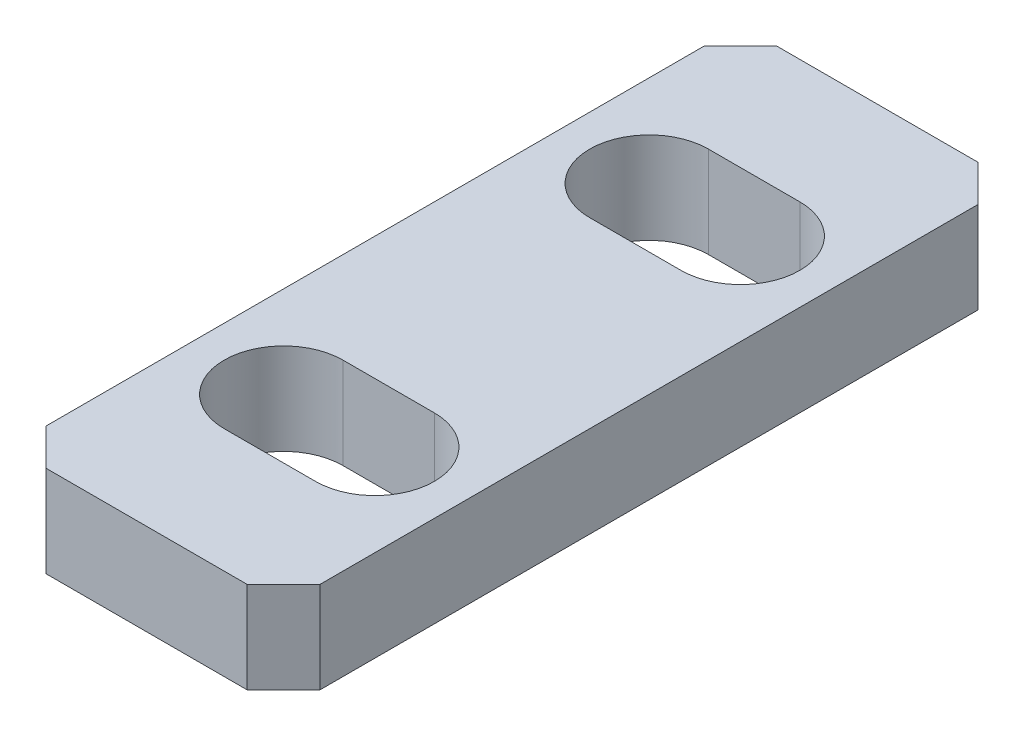
ISO-10303-21;
HEADER;
FILE_DESCRIPTION(('STEP AP214'),'2;1');
FILE_NAME('part.step','',(''),(''),'','','');
FILE_SCHEMA(('AUTOMOTIVE_DESIGN { 1 0 10303 214 1 1 1 1 }'));
ENDSEC;
DATA;
#1=APPLICATION_CONTEXT('core data for automotive mechanical design processes');
#2=APPLICATION_PROTOCOL_DEFINITION('international standard','automotive_design',2000,#1);
#3=PRODUCT_CONTEXT('',#1,'mechanical');
#4=PRODUCT('Part','Part','',(#3));
#5=PRODUCT_RELATED_PRODUCT_CATEGORY('part','',(#4));
#6=PRODUCT_DEFINITION_FORMATION('','',#4);
#7=PRODUCT_DEFINITION_CONTEXT('part definition',#1,'design');
#8=PRODUCT_DEFINITION('design','',#6,#7);
#9=PRODUCT_DEFINITION_SHAPE('','',#8);
#10=(LENGTH_UNIT() NAMED_UNIT(*) SI_UNIT(.MILLI.,.METRE.));
#11=(NAMED_UNIT(*) PLANE_ANGLE_UNIT() SI_UNIT($,.RADIAN.));
#12=(NAMED_UNIT(*) SI_UNIT($,.STERADIAN.) SOLID_ANGLE_UNIT());
#13=UNCERTAINTY_MEASURE_WITH_UNIT(LENGTH_MEASURE(1.E-05),#10,'distance_accuracy_value','');
#14=(GEOMETRIC_REPRESENTATION_CONTEXT(3) GLOBAL_UNCERTAINTY_ASSIGNED_CONTEXT((#13)) GLOBAL_UNIT_ASSIGNED_CONTEXT((#10,
#11,#12)) REPRESENTATION_CONTEXT('',''));
#15=CARTESIAN_POINT('',(0.,0.,0.));
#16=DIRECTION('',(0.,0.,1.));
#17=DIRECTION('',(1.,0.,0.));
#18=AXIS2_PLACEMENT_3D('',#15,#16,#17);
#19=CARTESIAN_POINT('',(0.,5.,0.));
#20=DIRECTION('',(0.,-1.,0.));
#21=DIRECTION('',(0.,0.,-1.));
#22=AXIS2_PLACEMENT_3D('',#19,#20,#21);
#23=PLANE('',#22);
#24=CARTESIAN_POINT('',(5.,5.,-30.));
#25=DIRECTION('',(0.,1.,0.));
#26=DIRECTION('',(0.,0.,1.));
#27=AXIS2_PLACEMENT_3D('',#24,#25,#26);
#28=CIRCLE('',#27,3.25);
#29=CARTESIAN_POINT('',(5.,5.,-33.25));
#30=VERTEX_POINT('',#29);
#31=CARTESIAN_POINT('',(5.,5.,-26.75));
#32=VERTEX_POINT('',#31);
#33=EDGE_CURVE('E201',#30,#32,#28,.T.);
#34=ORIENTED_EDGE('',*,*,#33,.F.);
#35=DIRECTION('',(-1.,0.,0.));
#36=VECTOR('',#35,1.);
#37=CARTESIAN_POINT('',(5.,5.,-33.25));
#38=LINE('',#37,#36);
#39=CARTESIAN_POINT('',(9.99999999999999,5.,-33.25));
#40=VERTEX_POINT('',#39);
#41=EDGE_CURVE('E212',#40,#30,#38,.T.);
#42=ORIENTED_EDGE('',*,*,#41,.F.);
#43=CARTESIAN_POINT('',(10.,5.,-30.));
#44=DIRECTION('',(0.,1.,0.));
#45=DIRECTION('',(0.,0.,1.));
#46=AXIS2_PLACEMENT_3D('',#43,#44,#45);
#47=CIRCLE('',#46,3.25);
#48=CARTESIAN_POINT('',(10.,5.,-26.75));
#49=VERTEX_POINT('',#48);
#50=EDGE_CURVE('E208',#49,#40,#47,.T.);
#51=ORIENTED_EDGE('',*,*,#50,.F.);
#52=DIRECTION('',(1.,0.,0.));
#53=VECTOR('',#52,1.);
#54=CARTESIAN_POINT('',(5.,5.,-26.75));
#55=LINE('',#54,#53);
#56=EDGE_CURVE('E204',#32,#49,#55,.T.);
#57=ORIENTED_EDGE('',*,*,#56,.F.);
#58=EDGE_LOOP('',(#34,#42,#51,#57));
#59=FACE_BOUND('',#58,.T.);
#60=DIRECTION('',(0.,0.,1.));
#61=VECTOR('',#60,1.);
#62=CARTESIAN_POINT('',(0.,5.,-1.99999999999999));
#63=LINE('',#62,#61);
#64=CARTESIAN_POINT('',(0.,5.,-38.));
#65=VERTEX_POINT('',#64);
#66=CARTESIAN_POINT('',(0.,5.,-1.99999999999999));
#67=VERTEX_POINT('',#66);
#68=EDGE_CURVE('E244',#65,#67,#63,.T.);
#69=ORIENTED_EDGE('',*,*,#68,.T.);
#70=DIRECTION('',(0.707106781186549,0.,0.707106781186546));
#71=VECTOR('',#70,1.);
#72=CARTESIAN_POINT('',(0.,5.,-1.99999999999999));
#73=LINE('',#72,#71);
#74=CARTESIAN_POINT('',(2.,5.,0.));
#75=VERTEX_POINT('',#74);
#76=EDGE_CURVE('E248',#67,#75,#73,.T.);
#77=ORIENTED_EDGE('',*,*,#76,.T.);
#78=DIRECTION('',(1.,0.,0.));
#79=VECTOR('',#78,1.);
#80=CARTESIAN_POINT('',(2.,5.,0.));
#81=LINE('',#80,#79);
#82=CARTESIAN_POINT('',(13.,5.,0.));
#83=VERTEX_POINT('',#82);
#84=EDGE_CURVE('E252',#75,#83,#81,.T.);
#85=ORIENTED_EDGE('',*,*,#84,.T.);
#86=DIRECTION('',(0.707106781186549,0.,-0.707106781186546));
#87=VECTOR('',#86,1.);
#88=CARTESIAN_POINT('',(13.,5.,0.));
#89=LINE('',#88,#87);
#90=CARTESIAN_POINT('',(15.,5.,-1.99999999999999));
#91=VERTEX_POINT('',#90);
#92=EDGE_CURVE('E255',#83,#91,#89,.T.);
#93=ORIENTED_EDGE('',*,*,#92,.T.);
#94=DIRECTION('',(0.,0.,-1.));
#95=VECTOR('',#94,1.);
#96=CARTESIAN_POINT('',(15.,5.,-1.99999999999999));
#97=LINE('',#96,#95);
#98=CARTESIAN_POINT('',(15.,5.,-38.));
#99=VERTEX_POINT('',#98);
#100=EDGE_CURVE('E258',#91,#99,#97,.T.);
#101=ORIENTED_EDGE('',*,*,#100,.T.);
#102=DIRECTION('',(-0.707106781186548,0.,-0.707106781186547));
#103=VECTOR('',#102,1.);
#104=CARTESIAN_POINT('',(13.,5.,-40.));
#105=LINE('',#104,#103);
#106=CARTESIAN_POINT('',(13.,5.,-40.));
#107=VERTEX_POINT('',#106);
#108=EDGE_CURVE('E261',#99,#107,#105,.T.);
#109=ORIENTED_EDGE('',*,*,#108,.T.);
#110=DIRECTION('',(-1.,0.,0.));
#111=VECTOR('',#110,1.);
#112=CARTESIAN_POINT('',(1.99999999999999,5.,-40.));
#113=LINE('',#112,#111);
#114=CARTESIAN_POINT('',(1.99999999999999,5.,-40.));
#115=VERTEX_POINT('',#114);
#116=EDGE_CURVE('E264',#107,#115,#113,.T.);
#117=ORIENTED_EDGE('',*,*,#116,.T.);
#118=DIRECTION('',(-0.707106781186546,0.,0.707106781186549));
#119=VECTOR('',#118,1.);
#120=CARTESIAN_POINT('',(0.,5.,-38.));
#121=LINE('',#120,#119);
#122=EDGE_CURVE('E267',#115,#65,#121,.T.);
#123=ORIENTED_EDGE('',*,*,#122,.T.);
#124=EDGE_LOOP('',(#69,#77,#85,#93,#101,#109,#117,#123));
#125=FACE_BOUND('',#124,.T.);
#126=CARTESIAN_POINT('',(5.,5.,-10.));
#127=DIRECTION('',(0.,1.,0.));
#128=DIRECTION('',(0.,0.,1.));
#129=AXIS2_PLACEMENT_3D('',#126,#127,#128);
#130=CIRCLE('',#129,3.25);
#131=CARTESIAN_POINT('',(5.,5.,-13.25));
#132=VERTEX_POINT('',#131);
#133=CARTESIAN_POINT('',(5.,5.,-6.75));
#134=VERTEX_POINT('',#133);
#135=EDGE_CURVE('E153',#132,#134,#130,.T.);
#136=ORIENTED_EDGE('',*,*,#135,.F.);
#137=DIRECTION('',(-1.,0.,0.));
#138=VECTOR('',#137,1.);
#139=CARTESIAN_POINT('',(5.,5.,-13.25));
#140=LINE('',#139,#138);
#141=CARTESIAN_POINT('',(10.,5.,-13.25));
#142=VERTEX_POINT('',#141);
#143=EDGE_CURVE('E179',#142,#132,#140,.T.);
#144=ORIENTED_EDGE('',*,*,#143,.F.);
#145=CARTESIAN_POINT('',(10.,5.,-10.));
#146=DIRECTION('',(0.,1.,0.));
#147=DIRECTION('',(0.,0.,1.));
#148=AXIS2_PLACEMENT_3D('',#145,#146,#147);
#149=CIRCLE('',#148,3.25);
#150=CARTESIAN_POINT('',(10.,5.,-6.75));
#151=VERTEX_POINT('',#150);
#152=EDGE_CURVE('E175',#151,#142,#149,.T.);
#153=ORIENTED_EDGE('',*,*,#152,.F.);
#154=DIRECTION('',(1.,0.,0.));
#155=VECTOR('',#154,1.);
#156=CARTESIAN_POINT('',(5.,5.,-6.75));
#157=LINE('',#156,#155);
#158=EDGE_CURVE('E162',#134,#151,#157,.T.);
#159=ORIENTED_EDGE('',*,*,#158,.F.);
#160=EDGE_LOOP('',(#136,#144,#153,#159));
#161=FACE_BOUND('',#160,.T.);
#162=ADVANCED_FACE('F39',(#59,#125,#161),#23,.F.);
#163=CARTESIAN_POINT('',(0.,0.,0.));
#164=DIRECTION('',(0.,-1.,0.));
#165=DIRECTION('',(0.,0.,-1.));
#166=AXIS2_PLACEMENT_3D('',#163,#164,#165);
#167=PLANE('',#166);
#168=DIRECTION('',(0.,0.,1.));
#169=VECTOR('',#168,1.);
#170=CARTESIAN_POINT('',(0.,0.,-1.99999999999999));
#171=LINE('',#170,#169);
#172=CARTESIAN_POINT('',(0.,0.,-38.));
#173=VERTEX_POINT('',#172);
#174=CARTESIAN_POINT('',(0.,0.,-1.99999999999999));
#175=VERTEX_POINT('',#174);
#176=EDGE_CURVE('E243',#173,#175,#171,.T.);
#177=ORIENTED_EDGE('',*,*,#176,.F.);
#178=DIRECTION('',(-0.707106781186546,0.,0.707106781186549));
#179=VECTOR('',#178,1.);
#180=CARTESIAN_POINT('',(0.,0.,-38.));
#181=LINE('',#180,#179);
#182=CARTESIAN_POINT('',(1.99999999999999,0.,-40.));
#183=VERTEX_POINT('',#182);
#184=EDGE_CURVE('E249',#183,#173,#181,.T.);
#185=ORIENTED_EDGE('',*,*,#184,.F.);
#186=DIRECTION('',(-1.,0.,0.));
#187=VECTOR('',#186,1.);
#188=CARTESIAN_POINT('',(1.99999999999999,0.,-40.));
#189=LINE('',#188,#187);
#190=CARTESIAN_POINT('',(13.,0.,-40.));
#191=VERTEX_POINT('',#190);
#192=EDGE_CURVE('E289',#191,#183,#189,.T.);
#193=ORIENTED_EDGE('',*,*,#192,.F.);
#194=DIRECTION('',(-0.707106781186548,0.,-0.707106781186547));
#195=VECTOR('',#194,1.);
#196=CARTESIAN_POINT('',(13.,0.,-40.));
#197=LINE('',#196,#195);
#198=CARTESIAN_POINT('',(15.,0.,-38.));
#199=VERTEX_POINT('',#198);
#200=EDGE_CURVE('E286',#199,#191,#197,.T.);
#201=ORIENTED_EDGE('',*,*,#200,.F.);
#202=DIRECTION('',(0.,0.,-1.));
#203=VECTOR('',#202,1.);
#204=CARTESIAN_POINT('',(15.,0.,-1.99999999999999));
#205=LINE('',#204,#203);
#206=CARTESIAN_POINT('',(15.,0.,-1.99999999999999));
#207=VERTEX_POINT('',#206);
#208=EDGE_CURVE('E283',#207,#199,#205,.T.);
#209=ORIENTED_EDGE('',*,*,#208,.F.);
#210=DIRECTION('',(0.707106781186549,0.,-0.707106781186546));
#211=VECTOR('',#210,1.);
#212=CARTESIAN_POINT('',(13.,0.,0.));
#213=LINE('',#212,#211);
#214=CARTESIAN_POINT('',(13.,0.,0.));
#215=VERTEX_POINT('',#214);
#216=EDGE_CURVE('E280',#215,#207,#213,.T.);
#217=ORIENTED_EDGE('',*,*,#216,.F.);
#218=DIRECTION('',(1.,0.,0.));
#219=VECTOR('',#218,1.);
#220=CARTESIAN_POINT('',(2.,0.,0.));
#221=LINE('',#220,#219);
#222=CARTESIAN_POINT('',(2.,0.,0.));
#223=VERTEX_POINT('',#222);
#224=EDGE_CURVE('E277',#223,#215,#221,.T.);
#225=ORIENTED_EDGE('',*,*,#224,.F.);
#226=DIRECTION('',(0.707106781186549,0.,0.707106781186546));
#227=VECTOR('',#226,1.);
#228=CARTESIAN_POINT('',(0.,0.,-1.99999999999999));
#229=LINE('',#228,#227);
#230=EDGE_CURVE('E274',#175,#223,#229,.T.);
#231=ORIENTED_EDGE('',*,*,#230,.F.);
#232=EDGE_LOOP('',(#177,#185,#193,#201,#209,#217,#225,#231));
#233=FACE_BOUND('',#232,.T.);
#234=DIRECTION('',(-1.,0.,0.));
#235=VECTOR('',#234,1.);
#236=CARTESIAN_POINT('',(5.,0.,-33.25));
#237=LINE('',#236,#235);
#238=CARTESIAN_POINT('',(9.99999999999999,0.,-33.25));
#239=VERTEX_POINT('',#238);
#240=CARTESIAN_POINT('',(5.,0.,-33.25));
#241=VERTEX_POINT('',#240);
#242=EDGE_CURVE('E205',#239,#241,#237,.T.);
#243=ORIENTED_EDGE('',*,*,#242,.T.);
#244=CARTESIAN_POINT('',(5.,0.,-30.));
#245=DIRECTION('',(0.,1.,0.));
#246=DIRECTION('',(0.,0.,1.));
#247=AXIS2_PLACEMENT_3D('',#244,#245,#246);
#248=CIRCLE('',#247,3.25);
#249=CARTESIAN_POINT('',(5.,0.,-26.75));
#250=VERTEX_POINT('',#249);
#251=EDGE_CURVE('E171',#241,#250,#248,.T.);
#252=ORIENTED_EDGE('',*,*,#251,.T.);
#253=DIRECTION('',(1.,0.,0.));
#254=VECTOR('',#253,1.);
#255=CARTESIAN_POINT('',(5.,0.,-26.75));
#256=LINE('',#255,#254);
#257=CARTESIAN_POINT('',(10.,0.,-26.75));
#258=VERTEX_POINT('',#257);
#259=EDGE_CURVE('E219',#250,#258,#256,.T.);
#260=ORIENTED_EDGE('',*,*,#259,.T.);
#261=CARTESIAN_POINT('',(10.,0.,-30.));
#262=DIRECTION('',(0.,1.,0.));
#263=DIRECTION('',(0.,0.,1.));
#264=AXIS2_PLACEMENT_3D('',#261,#262,#263);
#265=CIRCLE('',#264,3.25);
#266=EDGE_CURVE('E223',#258,#239,#265,.T.);
#267=ORIENTED_EDGE('',*,*,#266,.T.);
#268=EDGE_LOOP('',(#243,#252,#260,#267));
#269=FACE_BOUND('',#268,.T.);
#270=DIRECTION('',(-1.,0.,0.));
#271=VECTOR('',#270,1.);
#272=CARTESIAN_POINT('',(5.,0.,-13.25));
#273=LINE('',#272,#271);
#274=CARTESIAN_POINT('',(10.,0.,-13.25));
#275=VERTEX_POINT('',#274);
#276=CARTESIAN_POINT('',(5.,0.,-13.25));
#277=VERTEX_POINT('',#276);
#278=EDGE_CURVE('E163',#275,#277,#273,.T.);
#279=ORIENTED_EDGE('',*,*,#278,.T.);
#280=CARTESIAN_POINT('',(5.,0.,-10.));
#281=DIRECTION('',(0.,1.,0.));
#282=DIRECTION('',(0.,0.,1.));
#283=AXIS2_PLACEMENT_3D('',#280,#281,#282);
#284=CIRCLE('',#283,3.25);
#285=CARTESIAN_POINT('',(5.,0.,-6.75));
#286=VERTEX_POINT('',#285);
#287=EDGE_CURVE('E63',#277,#286,#284,.T.);
#288=ORIENTED_EDGE('',*,*,#287,.T.);
#289=DIRECTION('',(1.,0.,0.));
#290=VECTOR('',#289,1.);
#291=CARTESIAN_POINT('',(5.,0.,-6.75));
#292=LINE('',#291,#290);
#293=CARTESIAN_POINT('',(10.,0.,-6.75));
#294=VERTEX_POINT('',#293);
#295=EDGE_CURVE('E169',#286,#294,#292,.T.);
#296=ORIENTED_EDGE('',*,*,#295,.T.);
#297=CARTESIAN_POINT('',(10.,0.,-10.));
#298=DIRECTION('',(0.,1.,0.));
#299=DIRECTION('',(0.,0.,1.));
#300=AXIS2_PLACEMENT_3D('',#297,#298,#299);
#301=CIRCLE('',#300,3.25);
#302=EDGE_CURVE('E188',#294,#275,#301,.T.);
#303=ORIENTED_EDGE('',*,*,#302,.T.);
#304=EDGE_LOOP('',(#279,#288,#296,#303));
#305=FACE_BOUND('',#304,.T.);
#306=ADVANCED_FACE('F328',(#233,#269,#305),#167,.T.);
#307=CARTESIAN_POINT('',(0.,5.,-1.99999999999999));
#308=DIRECTION('',(1.,0.,0.));
#309=DIRECTION('',(0.,0.,-1.));
#310=AXIS2_PLACEMENT_3D('',#307,#308,#309);
#311=PLANE('',#310);
#312=ORIENTED_EDGE('',*,*,#176,.T.);
#313=DIRECTION('',(0.,-1.,0.));
#314=VECTOR('',#313,1.);
#315=CARTESIAN_POINT('',(0.,5.,-1.99999999999999));
#316=LINE('',#315,#314);
#317=EDGE_CURVE('E11',#67,#175,#316,.T.);
#318=ORIENTED_EDGE('',*,*,#317,.F.);
#319=ORIENTED_EDGE('',*,*,#68,.F.);
#320=DIRECTION('',(0.,-1.,0.));
#321=VECTOR('',#320,1.);
#322=CARTESIAN_POINT('',(0.,5.,-38.));
#323=LINE('',#322,#321);
#324=EDGE_CURVE('E270',#65,#173,#323,.T.);
#325=ORIENTED_EDGE('',*,*,#324,.T.);
#326=EDGE_LOOP('',(#312,#318,#319,#325));
#327=FACE_BOUND('',#326,.T.);
#328=ADVANCED_FACE('F41',(#327),#311,.F.);
#329=CARTESIAN_POINT('',(0.,5.,-1.99999999999999));
#330=DIRECTION('',(0.707106781186546,0.,-0.707106781186549));
#331=DIRECTION('',(-0.707106781186549,0.,-0.707106781186546));
#332=AXIS2_PLACEMENT_3D('',#329,#330,#331);
#333=PLANE('',#332);
#334=ORIENTED_EDGE('',*,*,#230,.T.);
#335=DIRECTION('',(0.,-1.,0.));
#336=VECTOR('',#335,1.);
#337=CARTESIAN_POINT('',(2.,5.,0.));
#338=LINE('',#337,#336);
#339=EDGE_CURVE('E48',#75,#223,#338,.T.);
#340=ORIENTED_EDGE('',*,*,#339,.F.);
#341=ORIENTED_EDGE('',*,*,#76,.F.);
#342=ORIENTED_EDGE('',*,*,#317,.T.);
#343=EDGE_LOOP('',(#334,#340,#341,#342));
#344=FACE_BOUND('',#343,.T.);
#345=ADVANCED_FACE('F345',(#344),#333,.F.);
#346=CARTESIAN_POINT('',(2.,5.,0.));
#347=DIRECTION('',(0.,0.,-1.));
#348=DIRECTION('',(-1.,0.,0.));
#349=AXIS2_PLACEMENT_3D('',#346,#347,#348);
#350=PLANE('',#349);
#351=ORIENTED_EDGE('',*,*,#224,.T.);
#352=DIRECTION('',(0.,-1.,0.));
#353=VECTOR('',#352,1.);
#354=CARTESIAN_POINT('',(13.,5.,0.));
#355=LINE('',#354,#353);
#356=EDGE_CURVE('E313',#83,#215,#355,.T.);
#357=ORIENTED_EDGE('',*,*,#356,.F.);
#358=ORIENTED_EDGE('',*,*,#84,.F.);
#359=ORIENTED_EDGE('',*,*,#339,.T.);
#360=EDGE_LOOP('',(#351,#357,#358,#359));
#361=FACE_BOUND('',#360,.T.);
#362=ADVANCED_FACE('F322',(#361),#350,.F.);
#363=CARTESIAN_POINT('',(13.,5.,0.));
#364=DIRECTION('',(-0.707106781186546,0.,-0.707106781186549));
#365=DIRECTION('',(-0.707106781186549,0.,0.707106781186546));
#366=AXIS2_PLACEMENT_3D('',#363,#364,#365);
#367=PLANE('',#366);
#368=ORIENTED_EDGE('',*,*,#216,.T.);
#369=DIRECTION('',(0.,-1.,0.));
#370=VECTOR('',#369,1.);
#371=CARTESIAN_POINT('',(15.,5.,-1.99999999999999));
#372=LINE('',#371,#370);
#373=EDGE_CURVE('E309',#91,#207,#372,.T.);
#374=ORIENTED_EDGE('',*,*,#373,.F.);
#375=ORIENTED_EDGE('',*,*,#92,.F.);
#376=ORIENTED_EDGE('',*,*,#356,.T.);
#377=EDGE_LOOP('',(#368,#374,#375,#376));
#378=FACE_BOUND('',#377,.T.);
#379=ADVANCED_FACE('F334',(#378),#367,.F.);
#380=CARTESIAN_POINT('',(15.,5.,-1.99999999999999));
#381=DIRECTION('',(-1.,0.,0.));
#382=DIRECTION('',(0.,0.,1.));
#383=AXIS2_PLACEMENT_3D('',#380,#381,#382);
#384=PLANE('',#383);
#385=ORIENTED_EDGE('',*,*,#208,.T.);
#386=DIRECTION('',(0.,-1.,0.));
#387=VECTOR('',#386,1.);
#388=CARTESIAN_POINT('',(15.,5.,-38.));
#389=LINE('',#388,#387);
#390=EDGE_CURVE('E305',#99,#199,#389,.T.);
#391=ORIENTED_EDGE('',*,*,#390,.F.);
#392=ORIENTED_EDGE('',*,*,#100,.F.);
#393=ORIENTED_EDGE('',*,*,#373,.T.);
#394=EDGE_LOOP('',(#385,#391,#392,#393));
#395=FACE_BOUND('',#394,.T.);
#396=ADVANCED_FACE('F338',(#395),#384,.F.);
#397=CARTESIAN_POINT('',(13.,5.,-40.));
#398=DIRECTION('',(-0.707106781186547,0.,0.707106781186548));
#399=DIRECTION('',(0.707106781186548,0.,0.707106781186547));
#400=AXIS2_PLACEMENT_3D('',#397,#398,#399);
#401=PLANE('',#400);
#402=ORIENTED_EDGE('',*,*,#200,.T.);
#403=DIRECTION('',(0.,-1.,0.));
#404=VECTOR('',#403,1.);
#405=CARTESIAN_POINT('',(13.,5.,-40.));
#406=LINE('',#405,#404);
#407=EDGE_CURVE('E301',#107,#191,#406,.T.);
#408=ORIENTED_EDGE('',*,*,#407,.F.);
#409=ORIENTED_EDGE('',*,*,#108,.F.);
#410=ORIENTED_EDGE('',*,*,#390,.T.);
#411=EDGE_LOOP('',(#402,#408,#409,#410));
#412=FACE_BOUND('',#411,.T.);
#413=ADVANCED_FACE('F358',(#412),#401,.F.);
#414=CARTESIAN_POINT('',(1.99999999999999,5.,-40.));
#415=DIRECTION('',(0.,0.,1.));
#416=DIRECTION('',(1.,0.,0.));
#417=AXIS2_PLACEMENT_3D('',#414,#415,#416);
#418=PLANE('',#417);
#419=ORIENTED_EDGE('',*,*,#192,.T.);
#420=DIRECTION('',(0.,-1.,0.));
#421=VECTOR('',#420,1.);
#422=CARTESIAN_POINT('',(1.99999999999999,5.,-40.));
#423=LINE('',#422,#421);
#424=EDGE_CURVE('E297',#115,#183,#423,.T.);
#425=ORIENTED_EDGE('',*,*,#424,.F.);
#426=ORIENTED_EDGE('',*,*,#116,.F.);
#427=ORIENTED_EDGE('',*,*,#407,.T.);
#428=EDGE_LOOP('',(#419,#425,#426,#427));
#429=FACE_BOUND('',#428,.T.);
#430=ADVANCED_FACE('F356',(#429),#418,.F.);
#431=CARTESIAN_POINT('',(0.,5.,-38.));
#432=DIRECTION('',(0.707106781186549,0.,0.707106781186546));
#433=DIRECTION('',(0.707106781186546,0.,-0.707106781186549));
#434=AXIS2_PLACEMENT_3D('',#431,#432,#433);
#435=PLANE('',#434);
#436=ORIENTED_EDGE('',*,*,#184,.T.);
#437=ORIENTED_EDGE('',*,*,#324,.F.);
#438=ORIENTED_EDGE('',*,*,#122,.F.);
#439=ORIENTED_EDGE('',*,*,#424,.T.);
#440=EDGE_LOOP('',(#436,#437,#438,#439));
#441=FACE_BOUND('',#440,.T.);
#442=ADVANCED_FACE('F351',(#441),#435,.F.);
#443=CARTESIAN_POINT('',(5.,5.,-30.));
#444=DIRECTION('',(0.,-1.,0.));
#445=DIRECTION('',(0.,0.,-1.));
#446=AXIS2_PLACEMENT_3D('',#443,#444,#445);
#447=CYLINDRICAL_SURFACE('',#446,3.25);
#448=ORIENTED_EDGE('',*,*,#251,.F.);
#449=DIRECTION('',(0.,-1.,0.));
#450=VECTOR('',#449,1.);
#451=CARTESIAN_POINT('',(5.,5.,-33.25));
#452=LINE('',#451,#450);
#453=EDGE_CURVE('E215',#30,#241,#452,.T.);
#454=ORIENTED_EDGE('',*,*,#453,.F.);
#455=ORIENTED_EDGE('',*,*,#33,.T.);
#456=DIRECTION('',(0.,-1.,0.));
#457=VECTOR('',#456,1.);
#458=CARTESIAN_POINT('',(5.,5.,-26.75));
#459=LINE('',#458,#457);
#460=EDGE_CURVE('E239',#32,#250,#459,.T.);
#461=ORIENTED_EDGE('',*,*,#460,.T.);
#462=EDGE_LOOP('',(#448,#454,#455,#461));
#463=FACE_BOUND('',#462,.T.);
#464=ADVANCED_FACE('F376',(#463),#447,.F.);
#465=CARTESIAN_POINT('',(5.,5.,-26.75));
#466=DIRECTION('',(0.,0.,-1.));
#467=DIRECTION('',(-1.,0.,0.));
#468=AXIS2_PLACEMENT_3D('',#465,#466,#467);
#469=PLANE('',#468);
#470=ORIENTED_EDGE('',*,*,#259,.F.);
#471=ORIENTED_EDGE('',*,*,#460,.F.);
#472=ORIENTED_EDGE('',*,*,#56,.T.);
#473=DIRECTION('',(0.,-1.,0.));
#474=VECTOR('',#473,1.);
#475=CARTESIAN_POINT('',(10.,5.,-26.75));
#476=LINE('',#475,#474);
#477=EDGE_CURVE('E236',#49,#258,#476,.T.);
#478=ORIENTED_EDGE('',*,*,#477,.T.);
#479=EDGE_LOOP('',(#470,#471,#472,#478));
#480=FACE_BOUND('',#479,.T.);
#481=ADVANCED_FACE('F383',(#480),#469,.T.);
#482=CARTESIAN_POINT('',(10.,5.,-30.));
#483=DIRECTION('',(0.,-1.,0.));
#484=DIRECTION('',(0.,0.,-1.));
#485=AXIS2_PLACEMENT_3D('',#482,#483,#484);
#486=CYLINDRICAL_SURFACE('',#485,3.25);
#487=ORIENTED_EDGE('',*,*,#266,.F.);
#488=ORIENTED_EDGE('',*,*,#477,.F.);
#489=ORIENTED_EDGE('',*,*,#50,.T.);
#490=DIRECTION('',(0.,-1.,0.));
#491=VECTOR('',#490,1.);
#492=CARTESIAN_POINT('',(9.99999999999999,5.,-33.25));
#493=LINE('',#492,#491);
#494=EDGE_CURVE('E233',#40,#239,#493,.T.);
#495=ORIENTED_EDGE('',*,*,#494,.T.);
#496=EDGE_LOOP('',(#487,#488,#489,#495));
#497=FACE_BOUND('',#496,.T.);
#498=ADVANCED_FACE('F388',(#497),#486,.F.);
#499=CARTESIAN_POINT('',(5.,5.,-33.25));
#500=DIRECTION('',(0.,0.,1.));
#501=DIRECTION('',(1.,0.,0.));
#502=AXIS2_PLACEMENT_3D('',#499,#500,#501);
#503=PLANE('',#502);
#504=ORIENTED_EDGE('',*,*,#242,.F.);
#505=ORIENTED_EDGE('',*,*,#494,.F.);
#506=ORIENTED_EDGE('',*,*,#41,.T.);
#507=ORIENTED_EDGE('',*,*,#453,.T.);
#508=EDGE_LOOP('',(#504,#505,#506,#507));
#509=FACE_BOUND('',#508,.T.);
#510=ADVANCED_FACE('F394',(#509),#503,.T.);
#511=CARTESIAN_POINT('',(5.,5.,-10.));
#512=DIRECTION('',(0.,-1.,0.));
#513=DIRECTION('',(0.,0.,-1.));
#514=AXIS2_PLACEMENT_3D('',#511,#512,#513);
#515=CYLINDRICAL_SURFACE('',#514,3.25);
#516=ORIENTED_EDGE('',*,*,#287,.F.);
#517=DIRECTION('',(0.,-1.,0.));
#518=VECTOR('',#517,1.);
#519=CARTESIAN_POINT('',(5.,5.,-13.25));
#520=LINE('',#519,#518);
#521=EDGE_CURVE('E157',#132,#277,#520,.T.);
#522=ORIENTED_EDGE('',*,*,#521,.F.);
#523=ORIENTED_EDGE('',*,*,#135,.T.);
#524=DIRECTION('',(0.,-1.,0.));
#525=VECTOR('',#524,1.);
#526=CARTESIAN_POINT('',(5.,5.,-6.75));
#527=LINE('',#526,#525);
#528=EDGE_CURVE('E156',#134,#286,#527,.T.);
#529=ORIENTED_EDGE('',*,*,#528,.T.);
#530=EDGE_LOOP('',(#516,#522,#523,#529));
#531=FACE_BOUND('',#530,.T.);
#532=ADVANCED_FACE('F155',(#531),#515,.F.);
#533=CARTESIAN_POINT('',(5.,5.,-6.75));
#534=DIRECTION('',(0.,0.,-1.));
#535=DIRECTION('',(-1.,0.,0.));
#536=AXIS2_PLACEMENT_3D('',#533,#534,#535);
#537=PLANE('',#536);
#538=ORIENTED_EDGE('',*,*,#295,.F.);
#539=ORIENTED_EDGE('',*,*,#528,.F.);
#540=ORIENTED_EDGE('',*,*,#158,.T.);
#541=DIRECTION('',(0.,-1.,0.));
#542=VECTOR('',#541,1.);
#543=CARTESIAN_POINT('',(10.,5.,-6.75));
#544=LINE('',#543,#542);
#545=EDGE_CURVE('E172',#151,#294,#544,.T.);
#546=ORIENTED_EDGE('',*,*,#545,.T.);
#547=EDGE_LOOP('',(#538,#539,#540,#546));
#548=FACE_BOUND('',#547,.T.);
#549=ADVANCED_FACE('F166',(#548),#537,.T.);
#550=CARTESIAN_POINT('',(10.,5.,-10.));
#551=DIRECTION('',(0.,-1.,0.));
#552=DIRECTION('',(0.,0.,-1.));
#553=AXIS2_PLACEMENT_3D('',#550,#551,#552);
#554=CYLINDRICAL_SURFACE('',#553,3.25);
#555=ORIENTED_EDGE('',*,*,#302,.F.);
#556=ORIENTED_EDGE('',*,*,#545,.F.);
#557=ORIENTED_EDGE('',*,*,#152,.T.);
#558=DIRECTION('',(0.,-1.,0.));
#559=VECTOR('',#558,1.);
#560=CARTESIAN_POINT('',(10.,5.,-13.25));
#561=LINE('',#560,#559);
#562=EDGE_CURVE('E55',#142,#275,#561,.T.);
#563=ORIENTED_EDGE('',*,*,#562,.T.);
#564=EDGE_LOOP('',(#555,#556,#557,#563));
#565=FACE_BOUND('',#564,.T.);
#566=ADVANCED_FACE('F413',(#565),#554,.F.);
#567=CARTESIAN_POINT('',(5.,5.,-13.25));
#568=DIRECTION('',(0.,0.,1.));
#569=DIRECTION('',(1.,0.,0.));
#570=AXIS2_PLACEMENT_3D('',#567,#568,#569);
#571=PLANE('',#570);
#572=ORIENTED_EDGE('',*,*,#278,.F.);
#573=ORIENTED_EDGE('',*,*,#562,.F.);
#574=ORIENTED_EDGE('',*,*,#143,.T.);
#575=ORIENTED_EDGE('',*,*,#521,.T.);
#576=EDGE_LOOP('',(#572,#573,#574,#575));
#577=FACE_BOUND('',#576,.T.);
#578=ADVANCED_FACE('F416',(#577),#571,.T.);
#579=CLOSED_SHELL('',(#162,#306,#328,#345,#362,#379,#396,#413,#430,#442,#464,#481,#498,#510,
#532,#549,#566,#578));
#580=MANIFOLD_SOLID_BREP('B2',#579);
#581=ADVANCED_BREP_SHAPE_REPRESENTATION('',(#18,#580),#14);
#582=SHAPE_DEFINITION_REPRESENTATION(#9,#581);
ENDSEC;
END-ISO-10303-21;
